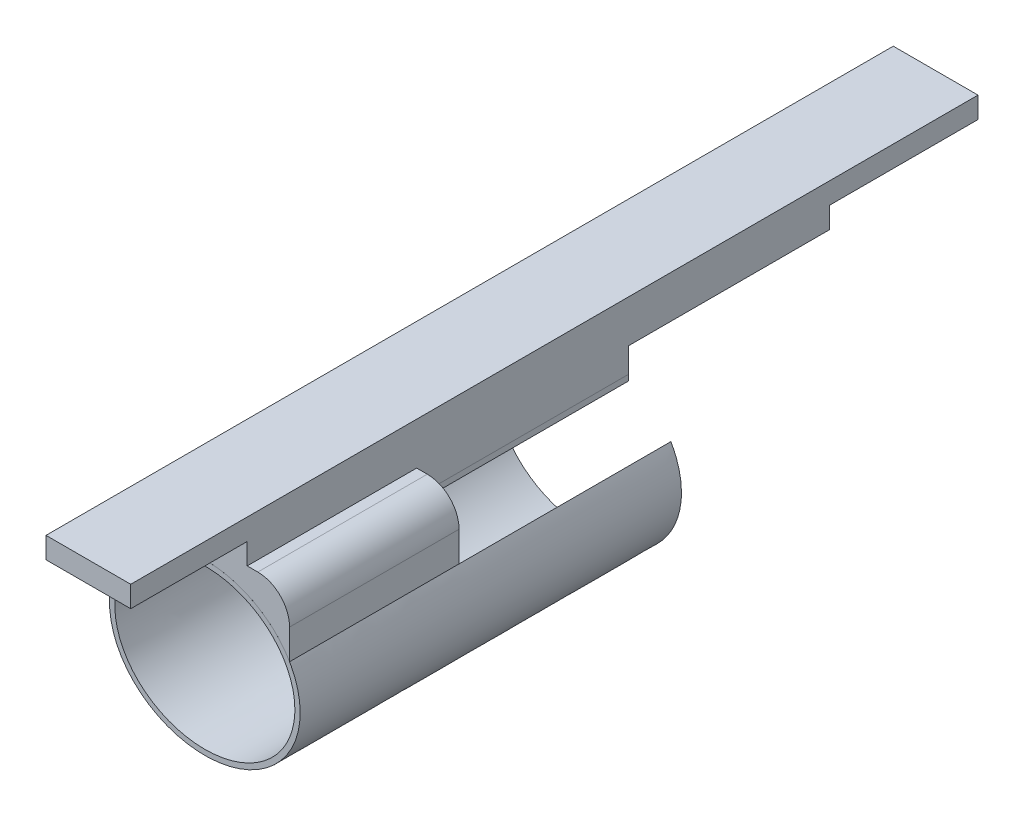
ISO-10303-21;
HEADER;
FILE_DESCRIPTION(('STEP AP214'),'2;1');
FILE_NAME('part.step','',(''),(''),'','','');
FILE_SCHEMA(('AUTOMOTIVE_DESIGN { 1 0 10303 214 1 1 1 1 }'));
ENDSEC;
DATA;
#1=APPLICATION_CONTEXT('core data for automotive mechanical design processes');
#2=APPLICATION_PROTOCOL_DEFINITION('international standard','automotive_design',2000,#1);
#3=PRODUCT_CONTEXT('',#1,'mechanical');
#4=PRODUCT('Part','Part','',(#3));
#5=PRODUCT_RELATED_PRODUCT_CATEGORY('part','',(#4));
#6=PRODUCT_DEFINITION_FORMATION('','',#4);
#7=PRODUCT_DEFINITION_CONTEXT('part definition',#1,'design');
#8=PRODUCT_DEFINITION('design','',#6,#7);
#9=PRODUCT_DEFINITION_SHAPE('','',#8);
#10=(LENGTH_UNIT() NAMED_UNIT(*) SI_UNIT(.MILLI.,.METRE.));
#11=(NAMED_UNIT(*) PLANE_ANGLE_UNIT() SI_UNIT($,.RADIAN.));
#12=(NAMED_UNIT(*) SI_UNIT($,.STERADIAN.) SOLID_ANGLE_UNIT());
#13=UNCERTAINTY_MEASURE_WITH_UNIT(LENGTH_MEASURE(1.E-05),#10,'distance_accuracy_value','');
#14=(GEOMETRIC_REPRESENTATION_CONTEXT(3) GLOBAL_UNCERTAINTY_ASSIGNED_CONTEXT((#13)) GLOBAL_UNIT_ASSIGNED_CONTEXT((#10,
#11,#12)) REPRESENTATION_CONTEXT('',''));
#15=CARTESIAN_POINT('',(0.,0.,0.));
#16=DIRECTION('',(0.,0.,1.));
#17=DIRECTION('',(1.,0.,0.));
#18=AXIS2_PLACEMENT_3D('',#15,#16,#17);
#19=CARTESIAN_POINT('',(0.,0.949999999999998,0.));
#20=DIRECTION('',(0.,1.,0.));
#21=DIRECTION('',(0.,0.,1.));
#22=AXIS2_PLACEMENT_3D('',#19,#20,#21);
#23=PLANE('',#22);
#24=DIRECTION('',(1.,0.,0.));
#25=VECTOR('',#24,1.);
#26=CARTESIAN_POINT('',(-0.4,0.949999999999998,2.));
#27=LINE('',#26,#25);
#28=CARTESIAN_POINT('',(-0.5,0.949999999999998,2.));
#29=VERTEX_POINT('',#28);
#30=CARTESIAN_POINT('',(-0.4,0.949999999999998,2.));
#31=VERTEX_POINT('',#30);
#32=EDGE_CURVE('E180',#29,#31,#27,.T.);
#33=ORIENTED_EDGE('',*,*,#32,.F.);
#34=DIRECTION('',(0.,0.,-1.));
#35=VECTOR('',#34,1.);
#36=CARTESIAN_POINT('',(-0.5,0.949999999999998,3.6));
#37=LINE('',#36,#35);
#38=CARTESIAN_POINT('',(-0.499999999999999,0.95,3.6));
#39=VERTEX_POINT('',#38);
#40=EDGE_CURVE('E219',#29,#39,#37,.F.);
#41=ORIENTED_EDGE('',*,*,#40,.T.);
#42=DIRECTION('',(-1.,0.,0.));
#43=VECTOR('',#42,1.);
#44=CARTESIAN_POINT('',(0.8,0.95,3.6));
#45=LINE('',#44,#43);
#46=CARTESIAN_POINT('',(-0.4,0.95,3.6));
#47=VERTEX_POINT('',#46);
#48=EDGE_CURVE('E236',#47,#39,#45,.T.);
#49=ORIENTED_EDGE('',*,*,#48,.F.);
#50=DIRECTION('',(0.,0.,1.));
#51=VECTOR('',#50,1.);
#52=CARTESIAN_POINT('',(-0.4,0.949999999999998,3.6));
#53=LINE('',#52,#51);
#54=EDGE_CURVE('E208',#31,#47,#53,.T.);
#55=ORIENTED_EDGE('',*,*,#54,.F.);
#56=EDGE_LOOP('',(#33,#41,#49,#55));
#57=FACE_BOUND('',#56,.T.);
#58=ADVANCED_FACE('F45',(#57),#23,.T.);
#59=DIRECTION('',(1.,0.,0.));
#60=VECTOR('',#59,1.);
#61=CARTESIAN_POINT('',(0.4,0.949999999999998,2.));
#62=LINE('',#61,#60);
#63=CARTESIAN_POINT('',(0.4,0.949999999999998,2.));
#64=VERTEX_POINT('',#63);
#65=CARTESIAN_POINT('',(0.5,0.949999999999998,2.));
#66=VERTEX_POINT('',#65);
#67=EDGE_CURVE('E60',#64,#66,#62,.T.);
#68=ORIENTED_EDGE('',*,*,#67,.F.);
#69=DIRECTION('',(0.,0.,-1.));
#70=VECTOR('',#69,1.);
#71=CARTESIAN_POINT('',(0.4,0.949999999999998,3.6));
#72=LINE('',#71,#70);
#73=CARTESIAN_POINT('',(0.4,0.95,3.6));
#74=VERTEX_POINT('',#73);
#75=EDGE_CURVE('E196',#74,#64,#72,.T.);
#76=ORIENTED_EDGE('',*,*,#75,.F.);
#77=CARTESIAN_POINT('',(0.5,0.95,3.6));
#78=VERTEX_POINT('',#77);
#79=EDGE_CURVE('E233',#78,#74,#45,.T.);
#80=ORIENTED_EDGE('',*,*,#79,.F.);
#81=DIRECTION('',(0.,0.,1.));
#82=VECTOR('',#81,1.);
#83=CARTESIAN_POINT('',(0.5,0.949999999999998,0.));
#84=LINE('',#83,#82);
#85=EDGE_CURVE('E226',#78,#66,#84,.F.);
#86=ORIENTED_EDGE('',*,*,#85,.T.);
#87=EDGE_LOOP('',(#68,#76,#80,#86));
#88=FACE_BOUND('',#87,.T.);
#89=ADVANCED_FACE('F383',(#88),#23,.T.);
#90=CARTESIAN_POINT('',(0.8,0.8,0.));
#91=DIRECTION('',(0.,0.,1.));
#92=DIRECTION('',(1.,0.,0.));
#93=AXIS2_PLACEMENT_3D('',#90,#91,#92);
#94=PLANE('',#93);
#95=CARTESIAN_POINT('',(0.,0.,0.));
#96=DIRECTION('',(0.,0.,1.));
#97=DIRECTION('',(1.,0.,0.));
#98=AXIS2_PLACEMENT_3D('',#95,#96,#97);
#99=ELLIPSE('',#98,0.9,0.8);
#100=CARTESIAN_POINT('',(0.4,0.716645133182093,0.));
#101=VERTEX_POINT('',#100);
#102=CARTESIAN_POINT('',(-0.4,0.716645133182093,0.));
#103=VERTEX_POINT('',#102);
#104=EDGE_CURVE('E176',#101,#103,#99,.T.);
#105=ORIENTED_EDGE('',*,*,#104,.T.);
#106=DIRECTION('',(0.,1.,0.));
#107=VECTOR('',#106,1.);
#108=CARTESIAN_POINT('',(-0.4,-0.801,0.));
#109=LINE('',#108,#107);
#110=CARTESIAN_POINT('',(-0.4,0.949999999999998,0.));
#111=VERTEX_POINT('',#110);
#112=EDGE_CURVE('E169',#103,#111,#109,.T.);
#113=ORIENTED_EDGE('',*,*,#112,.T.);
#114=DIRECTION('',(1.,0.,0.));
#115=VECTOR('',#114,1.);
#116=CARTESIAN_POINT('',(0.8,0.95,0.));
#117=LINE('',#116,#115);
#118=CARTESIAN_POINT('',(0.4,0.949999999999998,0.));
#119=VERTEX_POINT('',#118);
#120=EDGE_CURVE('E173',#111,#119,#117,.T.);
#121=ORIENTED_EDGE('',*,*,#120,.T.);
#122=DIRECTION('',(0.,1.,0.));
#123=VECTOR('',#122,1.);
#124=CARTESIAN_POINT('',(0.4,-0.801,0.));
#125=LINE('',#124,#123);
#126=EDGE_CURVE('E320',#101,#119,#125,.T.);
#127=ORIENTED_EDGE('',*,*,#126,.F.);
#128=EDGE_LOOP('',(#105,#113,#121,#127));
#129=FACE_BOUND('',#128,.T.);
#130=ADVANCED_FACE('F171',(#129),#94,.F.);
#131=CARTESIAN_POINT('',(-0.8,0.8,0.));
#132=DIRECTION('',(1.,0.,0.));
#133=DIRECTION('',(0.,0.,-1.));
#134=AXIS2_PLACEMENT_3D('',#131,#132,#133);
#135=PLANE('',#134);
#136=DIRECTION('',(0.,0.,-1.));
#137=VECTOR('',#136,1.);
#138=CARTESIAN_POINT('',(-0.8,0.649999999999998,0.));
#139=LINE('',#138,#137);
#140=CARTESIAN_POINT('',(-0.8,0.649999999999998,3.6));
#141=VERTEX_POINT('',#140);
#142=CARTESIAN_POINT('',(-0.8,0.649999999999998,2.));
#143=VERTEX_POINT('',#142);
#144=EDGE_CURVE('E221',#141,#143,#139,.T.);
#145=ORIENTED_EDGE('',*,*,#144,.T.);
#146=DIRECTION('',(0.,1.,0.));
#147=VECTOR('',#146,1.);
#148=CARTESIAN_POINT('',(-0.8,-0.801,2.));
#149=LINE('',#148,#147);
#150=CARTESIAN_POINT('',(-0.8,0.366498277832681,2.));
#151=VERTEX_POINT('',#150);
#152=EDGE_CURVE('E68',#151,#143,#149,.T.);
#153=ORIENTED_EDGE('',*,*,#152,.F.);
#154=DIRECTION('',(0.,0.,-1.));
#155=VECTOR('',#154,1.);
#156=CARTESIAN_POINT('',(-0.8,0.366498277832681,3.6));
#157=LINE('',#156,#155);
#158=CARTESIAN_POINT('',(-0.8,0.36649827783268,3.6));
#159=VERTEX_POINT('',#158);
#160=EDGE_CURVE('E260',#151,#159,#157,.F.);
#161=ORIENTED_EDGE('',*,*,#160,.T.);
#162=DIRECTION('',(0.,1.,0.));
#163=VECTOR('',#162,1.);
#164=CARTESIAN_POINT('',(-0.8,0.8,3.6));
#165=LINE('',#164,#163);
#166=EDGE_CURVE('E188',#159,#141,#165,.T.);
#167=ORIENTED_EDGE('',*,*,#166,.T.);
#168=EDGE_LOOP('',(#145,#153,#161,#167));
#169=FACE_BOUND('',#168,.T.);
#170=ADVANCED_FACE('F387',(#169),#135,.F.);
#171=CARTESIAN_POINT('',(0.8,0.8,3.6));
#172=DIRECTION('',(0.,0.,-1.));
#173=DIRECTION('',(-1.,0.,0.));
#174=AXIS2_PLACEMENT_3D('',#171,#172,#173);
#175=PLANE('',#174);
#176=DIRECTION('',(0.,1.,0.));
#177=VECTOR('',#176,1.);
#178=CARTESIAN_POINT('',(0.8,0.8,3.6));
#179=LINE('',#178,#177);
#180=CARTESIAN_POINT('',(0.8,0.36649827783268,3.6));
#181=VERTEX_POINT('',#180);
#182=CARTESIAN_POINT('',(0.8,0.649999999999998,3.6));
#183=VERTEX_POINT('',#182);
#184=EDGE_CURVE('E211',#181,#183,#179,.T.);
#185=ORIENTED_EDGE('',*,*,#184,.T.);
#186=CARTESIAN_POINT('',(0.5,0.649999999999998,3.6));
#187=DIRECTION('',(0.,0.,-1.));
#188=DIRECTION('',(-1.,0.,0.));
#189=AXIS2_PLACEMENT_3D('',#186,#187,#188);
#190=CIRCLE('',#189,0.3);
#191=EDGE_CURVE('E229',#183,#78,#190,.F.);
#192=ORIENTED_EDGE('',*,*,#191,.T.);
#193=ORIENTED_EDGE('',*,*,#79,.T.);
#194=DIRECTION('',(0.,-1.,0.));
#195=VECTOR('',#194,1.);
#196=CARTESIAN_POINT('',(0.4,1.15,3.6));
#197=LINE('',#196,#195);
#198=CARTESIAN_POINT('',(0.4,1.15,3.6));
#199=VERTEX_POINT('',#198);
#200=EDGE_CURVE('E251',#199,#74,#197,.T.);
#201=ORIENTED_EDGE('',*,*,#200,.F.);
#202=DIRECTION('',(1.,0.,0.));
#203=VECTOR('',#202,1.);
#204=CARTESIAN_POINT('',(-0.4,1.15,3.6));
#205=LINE('',#204,#203);
#206=CARTESIAN_POINT('',(-0.4,1.15,3.6));
#207=VERTEX_POINT('',#206);
#208=EDGE_CURVE('E269',#207,#199,#205,.T.);
#209=ORIENTED_EDGE('',*,*,#208,.F.);
#210=DIRECTION('',(0.,-1.,0.));
#211=VECTOR('',#210,1.);
#212=CARTESIAN_POINT('',(-0.4,1.15,3.6));
#213=LINE('',#212,#211);
#214=EDGE_CURVE('E254',#207,#47,#213,.T.);
#215=ORIENTED_EDGE('',*,*,#214,.T.);
#216=ORIENTED_EDGE('',*,*,#48,.T.);
#217=CARTESIAN_POINT('',(-0.5,0.649999999999998,3.6));
#218=DIRECTION('',(0.,0.,-1.));
#219=DIRECTION('',(-1.,0.,0.));
#220=AXIS2_PLACEMENT_3D('',#217,#218,#219);
#221=CIRCLE('',#220,0.3);
#222=EDGE_CURVE('E231',#39,#141,#221,.F.);
#223=ORIENTED_EDGE('',*,*,#222,.T.);
#224=ORIENTED_EDGE('',*,*,#166,.F.);
#225=CARTESIAN_POINT('',(0.,0.,3.6));
#226=DIRECTION('',(0.,0.,1.));
#227=DIRECTION('',(1.,0.,0.));
#228=AXIS2_PLACEMENT_3D('',#225,#226,#227);
#229=ELLIPSE('',#228,0.9,0.8);
#230=EDGE_CURVE('E370',#159,#181,#229,.F.);
#231=ORIENTED_EDGE('',*,*,#230,.T.);
#232=EDGE_LOOP('',(#185,#192,#193,#201,#209,#215,#216,#223,#224,#231));
#233=FACE_BOUND('',#232,.T.);
#234=ADVANCED_FACE('F338',(#233),#175,.F.);
#235=CARTESIAN_POINT('',(0.8,0.8,0.));
#236=DIRECTION('',(-1.,0.,0.));
#237=DIRECTION('',(0.,0.,1.));
#238=AXIS2_PLACEMENT_3D('',#235,#236,#237);
#239=PLANE('',#238);
#240=DIRECTION('',(0.,0.,-1.));
#241=VECTOR('',#240,1.);
#242=CARTESIAN_POINT('',(0.8,0.36649827783268,3.6));
#243=LINE('',#242,#241);
#244=CARTESIAN_POINT('',(0.8,0.36649827783268,2.));
#245=VERTEX_POINT('',#244);
#246=EDGE_CURVE('E367',#181,#245,#243,.T.);
#247=ORIENTED_EDGE('',*,*,#246,.T.);
#248=DIRECTION('',(0.,1.,0.));
#249=VECTOR('',#248,1.);
#250=CARTESIAN_POINT('',(0.8,-0.801,2.));
#251=LINE('',#250,#249);
#252=CARTESIAN_POINT('',(0.8,0.649999999999998,2.));
#253=VERTEX_POINT('',#252);
#254=EDGE_CURVE('E317',#245,#253,#251,.T.);
#255=ORIENTED_EDGE('',*,*,#254,.T.);
#256=DIRECTION('',(0.,0.,1.));
#257=VECTOR('',#256,1.);
#258=CARTESIAN_POINT('',(0.8,0.649999999999998,3.6));
#259=LINE('',#258,#257);
#260=EDGE_CURVE('E210',#253,#183,#259,.T.);
#261=ORIENTED_EDGE('',*,*,#260,.T.);
#262=ORIENTED_EDGE('',*,*,#184,.F.);
#263=EDGE_LOOP('',(#247,#255,#261,#262));
#264=FACE_BOUND('',#263,.T.);
#265=ADVANCED_FACE('F381',(#264),#239,.F.);
#266=CARTESIAN_POINT('',(0.,0.,3.6));
#267=DIRECTION('',(0.,0.,1.));
#268=DIRECTION('',(1.,0.,0.));
#269=AXIS2_PLACEMENT_3D('',#266,#267,#268);
#270=ELLIPSE('',#269,0.9,0.8);
#271=DIRECTION('',(0.,0.,-1.));
#272=VECTOR('',#271,1.);
#273=SURFACE_OF_LINEAR_EXTRUSION('',#270,#272);
#274=CARTESIAN_POINT('',(0.,0.,2.));
#275=DIRECTION('',(0.,0.,1.));
#276=DIRECTION('',(1.,0.,0.));
#277=AXIS2_PLACEMENT_3D('',#274,#275,#276);
#278=ELLIPSE('',#277,0.9,0.8);
#279=CARTESIAN_POINT('',(-0.4,0.716645133182093,2.));
#280=VERTEX_POINT('',#279);
#281=EDGE_CURVE('E314',#280,#151,#278,.T.);
#282=ORIENTED_EDGE('',*,*,#281,.F.);
#283=DIRECTION('',(0.,0.,-1.));
#284=VECTOR('',#283,1.);
#285=CARTESIAN_POINT('',(-0.4,0.716645133182093,3.6));
#286=LINE('',#285,#284);
#287=EDGE_CURVE('E13',#103,#280,#286,.F.);
#288=ORIENTED_EDGE('',*,*,#287,.F.);
#289=ORIENTED_EDGE('',*,*,#104,.F.);
#290=DIRECTION('',(0.,0.,-1.));
#291=VECTOR('',#290,1.);
#292=CARTESIAN_POINT('',(0.4,0.716645133182093,3.6));
#293=LINE('',#292,#291);
#294=CARTESIAN_POINT('',(0.4,0.716645133182093,2.));
#295=VERTEX_POINT('',#294);
#296=EDGE_CURVE('E53',#295,#101,#293,.T.);
#297=ORIENTED_EDGE('',*,*,#296,.F.);
#298=CARTESIAN_POINT('',(0.,0.,2.));
#299=DIRECTION('',(0.,0.,1.));
#300=DIRECTION('',(1.,0.,0.));
#301=AXIS2_PLACEMENT_3D('',#298,#299,#300);
#302=ELLIPSE('',#301,0.9,0.8);
#303=EDGE_CURVE('E312',#245,#295,#302,.T.);
#304=ORIENTED_EDGE('',*,*,#303,.F.);
#305=ORIENTED_EDGE('',*,*,#246,.F.);
#306=ORIENTED_EDGE('',*,*,#230,.F.);
#307=ORIENTED_EDGE('',*,*,#160,.F.);
#308=EDGE_LOOP('',(#282,#288,#289,#297,#304,#305,#306,#307));
#309=FACE_BOUND('',#308,.T.);
#310=ADVANCED_FACE('F377',(#309),#273,.T.);
#311=CARTESIAN_POINT('',(0.,0.949999999999998,0.));
#312=DIRECTION('',(0.,-1.,0.));
#313=DIRECTION('',(0.,0.,-1.));
#314=AXIS2_PLACEMENT_3D('',#311,#312,#313);
#315=PLANE('',#314);
#316=ORIENTED_EDGE('',*,*,#120,.F.);
#317=CARTESIAN_POINT('',(-0.4,0.949999999999998,-1.9));
#318=VERTEX_POINT('',#317);
#319=EDGE_CURVE('E186',#318,#111,#53,.T.);
#320=ORIENTED_EDGE('',*,*,#319,.F.);
#321=DIRECTION('',(-1.,0.,0.));
#322=VECTOR('',#321,1.);
#323=CARTESIAN_POINT('',(-0.4,0.949999999999998,-1.9));
#324=LINE('',#323,#322);
#325=CARTESIAN_POINT('',(0.4,0.949999999999998,-1.9));
#326=VERTEX_POINT('',#325);
#327=EDGE_CURVE('E250',#326,#318,#324,.T.);
#328=ORIENTED_EDGE('',*,*,#327,.F.);
#329=EDGE_CURVE('E187',#119,#326,#72,.T.);
#330=ORIENTED_EDGE('',*,*,#329,.F.);
#331=EDGE_LOOP('',(#316,#320,#328,#330));
#332=FACE_BOUND('',#331,.T.);
#333=ADVANCED_FACE('F184',(#332),#315,.T.);
#334=CARTESIAN_POINT('',(-0.4,1.15,3.6));
#335=DIRECTION('',(1.,0.,0.));
#336=DIRECTION('',(0.,0.,-1.));
#337=AXIS2_PLACEMENT_3D('',#334,#335,#336);
#338=PLANE('',#337);
#339=ORIENTED_EDGE('',*,*,#319,.T.);
#340=ORIENTED_EDGE('',*,*,#112,.F.);
#341=ORIENTED_EDGE('',*,*,#287,.T.);
#342=DIRECTION('',(0.,1.,0.));
#343=VECTOR('',#342,1.);
#344=CARTESIAN_POINT('',(-0.4,-0.801,2.));
#345=LINE('',#344,#343);
#346=EDGE_CURVE('E316',#280,#31,#345,.T.);
#347=ORIENTED_EDGE('',*,*,#346,.T.);
#348=ORIENTED_EDGE('',*,*,#54,.T.);
#349=ORIENTED_EDGE('',*,*,#214,.F.);
#350=DIRECTION('',(0.,0.,1.));
#351=VECTOR('',#350,1.);
#352=CARTESIAN_POINT('',(-0.4,1.15,-3.3));
#353=LINE('',#352,#351);
#354=CARTESIAN_POINT('',(-0.4,1.15,4.7));
#355=VERTEX_POINT('',#354);
#356=EDGE_CURVE('E276',#207,#355,#353,.T.);
#357=ORIENTED_EDGE('',*,*,#356,.T.);
#358=DIRECTION('',(0.,-1.,0.));
#359=VECTOR('',#358,1.);
#360=CARTESIAN_POINT('',(-0.4,1.35,4.7));
#361=LINE('',#360,#359);
#362=CARTESIAN_POINT('',(-0.4,1.35,4.7));
#363=VERTEX_POINT('',#362);
#364=EDGE_CURVE('E293',#363,#355,#361,.T.);
#365=ORIENTED_EDGE('',*,*,#364,.F.);
#366=DIRECTION('',(0.,0.,1.));
#367=VECTOR('',#366,1.);
#368=CARTESIAN_POINT('',(-0.4,1.35,-3.3));
#369=LINE('',#368,#367);
#370=CARTESIAN_POINT('',(-0.4,1.35,-3.3));
#371=VERTEX_POINT('',#370);
#372=EDGE_CURVE('E306',#371,#363,#369,.T.);
#373=ORIENTED_EDGE('',*,*,#372,.F.);
#374=DIRECTION('',(0.,-1.,0.));
#375=VECTOR('',#374,1.);
#376=CARTESIAN_POINT('',(-0.4,1.35,-3.3));
#377=LINE('',#376,#375);
#378=CARTESIAN_POINT('',(-0.4,1.15,-3.3));
#379=VERTEX_POINT('',#378);
#380=EDGE_CURVE('E199',#371,#379,#377,.T.);
#381=ORIENTED_EDGE('',*,*,#380,.T.);
#382=CARTESIAN_POINT('',(-0.4,1.15,-1.9));
#383=VERTEX_POINT('',#382);
#384=EDGE_CURVE('E279',#379,#383,#353,.T.);
#385=ORIENTED_EDGE('',*,*,#384,.T.);
#386=DIRECTION('',(0.,-1.,0.));
#387=VECTOR('',#386,1.);
#388=CARTESIAN_POINT('',(-0.4,1.15,-1.9));
#389=LINE('',#388,#387);
#390=EDGE_CURVE('E193',#383,#318,#389,.T.);
#391=ORIENTED_EDGE('',*,*,#390,.T.);
#392=EDGE_LOOP('',(#339,#340,#341,#347,#348,#349,#357,#365,#373,#381,#385,#391));
#393=FACE_BOUND('',#392,.T.);
#394=ADVANCED_FACE('F191',(#393),#338,.F.);
#395=CARTESIAN_POINT('',(0.4,1.15,3.6));
#396=DIRECTION('',(-1.,0.,0.));
#397=DIRECTION('',(0.,0.,1.));
#398=AXIS2_PLACEMENT_3D('',#395,#396,#397);
#399=PLANE('',#398);
#400=ORIENTED_EDGE('',*,*,#75,.T.);
#401=DIRECTION('',(0.,1.,0.));
#402=VECTOR('',#401,1.);
#403=CARTESIAN_POINT('',(0.4,-0.801,2.));
#404=LINE('',#403,#402);
#405=EDGE_CURVE('E319',#295,#64,#404,.T.);
#406=ORIENTED_EDGE('',*,*,#405,.F.);
#407=ORIENTED_EDGE('',*,*,#296,.T.);
#408=ORIENTED_EDGE('',*,*,#126,.T.);
#409=ORIENTED_EDGE('',*,*,#329,.T.);
#410=DIRECTION('',(0.,-1.,0.));
#411=VECTOR('',#410,1.);
#412=CARTESIAN_POINT('',(0.4,1.15,-1.9));
#413=LINE('',#412,#411);
#414=CARTESIAN_POINT('',(0.4,1.15,-1.9));
#415=VERTEX_POINT('',#414);
#416=EDGE_CURVE('E255',#415,#326,#413,.T.);
#417=ORIENTED_EDGE('',*,*,#416,.F.);
#418=DIRECTION('',(0.,0.,-1.));
#419=VECTOR('',#418,1.);
#420=CARTESIAN_POINT('',(0.4,1.15,-3.3));
#421=LINE('',#420,#419);
#422=CARTESIAN_POINT('',(0.4,1.15,-3.3));
#423=VERTEX_POINT('',#422);
#424=EDGE_CURVE('E301',#415,#423,#421,.T.);
#425=ORIENTED_EDGE('',*,*,#424,.T.);
#426=DIRECTION('',(0.,-1.,0.));
#427=VECTOR('',#426,1.);
#428=CARTESIAN_POINT('',(0.4,1.35,-3.3));
#429=LINE('',#428,#427);
#430=CARTESIAN_POINT('',(0.4,1.35,-3.3));
#431=VERTEX_POINT('',#430);
#432=EDGE_CURVE('E194',#431,#423,#429,.T.);
#433=ORIENTED_EDGE('',*,*,#432,.F.);
#434=DIRECTION('',(0.,0.,-1.));
#435=VECTOR('',#434,1.);
#436=CARTESIAN_POINT('',(0.4,1.35,-3.3));
#437=LINE('',#436,#435);
#438=CARTESIAN_POINT('',(0.400000000000001,1.35,4.7));
#439=VERTEX_POINT('',#438);
#440=EDGE_CURVE('E289',#439,#431,#437,.T.);
#441=ORIENTED_EDGE('',*,*,#440,.F.);
#442=DIRECTION('',(0.,-1.,0.));
#443=VECTOR('',#442,1.);
#444=CARTESIAN_POINT('',(0.400000000000001,1.35,4.7));
#445=LINE('',#444,#443);
#446=CARTESIAN_POINT('',(0.400000000000001,1.15,4.7));
#447=VERTEX_POINT('',#446);
#448=EDGE_CURVE('E290',#439,#447,#445,.T.);
#449=ORIENTED_EDGE('',*,*,#448,.T.);
#450=EDGE_CURVE('E299',#447,#199,#421,.T.);
#451=ORIENTED_EDGE('',*,*,#450,.T.);
#452=ORIENTED_EDGE('',*,*,#200,.T.);
#453=EDGE_LOOP('',(#400,#406,#407,#408,#409,#417,#425,#433,#441,#449,#451,#452));
#454=FACE_BOUND('',#453,.T.);
#455=ADVANCED_FACE('F350',(#454),#399,.F.);
#456=CARTESIAN_POINT('',(-0.4,1.15,-1.9));
#457=DIRECTION('',(0.,0.,1.));
#458=DIRECTION('',(1.,0.,0.));
#459=AXIS2_PLACEMENT_3D('',#456,#457,#458);
#460=PLANE('',#459);
#461=ORIENTED_EDGE('',*,*,#327,.T.);
#462=ORIENTED_EDGE('',*,*,#390,.F.);
#463=DIRECTION('',(-1.,0.,0.));
#464=VECTOR('',#463,1.);
#465=CARTESIAN_POINT('',(-0.4,1.15,-1.9));
#466=LINE('',#465,#464);
#467=EDGE_CURVE('E264',#415,#383,#466,.T.);
#468=ORIENTED_EDGE('',*,*,#467,.F.);
#469=ORIENTED_EDGE('',*,*,#416,.T.);
#470=EDGE_LOOP('',(#461,#462,#468,#469));
#471=FACE_BOUND('',#470,.T.);
#472=ADVANCED_FACE('F364',(#471),#460,.F.);
#473=CARTESIAN_POINT('',(0.,1.15,0.));
#474=DIRECTION('',(0.,-1.,0.));
#475=DIRECTION('',(0.,0.,-1.));
#476=AXIS2_PLACEMENT_3D('',#473,#474,#475);
#477=PLANE('',#476);
#478=ORIENTED_EDGE('',*,*,#356,.F.);
#479=ORIENTED_EDGE('',*,*,#208,.T.);
#480=ORIENTED_EDGE('',*,*,#450,.F.);
#481=DIRECTION('',(1.,0.,0.));
#482=VECTOR('',#481,1.);
#483=CARTESIAN_POINT('',(0.400000000000001,1.15,4.7));
#484=LINE('',#483,#482);
#485=EDGE_CURVE('E286',#355,#447,#484,.T.);
#486=ORIENTED_EDGE('',*,*,#485,.F.);
#487=EDGE_LOOP('',(#478,#479,#480,#486));
#488=FACE_BOUND('',#487,.T.);
#489=ADVANCED_FACE('F343',(#488),#477,.T.);
#490=CARTESIAN_POINT('',(0.4,1.35,-3.3));
#491=DIRECTION('',(0.,0.,1.));
#492=DIRECTION('',(1.,0.,0.));
#493=AXIS2_PLACEMENT_3D('',#490,#491,#492);
#494=PLANE('',#493);
#495=DIRECTION('',(-1.,0.,0.));
#496=VECTOR('',#495,1.);
#497=CARTESIAN_POINT('',(0.4,1.15,-3.3));
#498=LINE('',#497,#496);
#499=EDGE_CURVE('E280',#423,#379,#498,.T.);
#500=ORIENTED_EDGE('',*,*,#499,.T.);
#501=ORIENTED_EDGE('',*,*,#380,.F.);
#502=DIRECTION('',(-1.,0.,0.));
#503=VECTOR('',#502,1.);
#504=CARTESIAN_POINT('',(0.4,1.35,-3.3));
#505=LINE('',#504,#503);
#506=EDGE_CURVE('E308',#431,#371,#505,.T.);
#507=ORIENTED_EDGE('',*,*,#506,.F.);
#508=ORIENTED_EDGE('',*,*,#432,.T.);
#509=EDGE_LOOP('',(#500,#501,#507,#508));
#510=FACE_BOUND('',#509,.T.);
#511=ADVANCED_FACE('F463',(#510),#494,.F.);
#512=CARTESIAN_POINT('',(0.400000000000001,1.35,4.7));
#513=DIRECTION('',(0.,0.,-1.));
#514=DIRECTION('',(-1.,0.,0.));
#515=AXIS2_PLACEMENT_3D('',#512,#513,#514);
#516=PLANE('',#515);
#517=ORIENTED_EDGE('',*,*,#485,.T.);
#518=ORIENTED_EDGE('',*,*,#448,.F.);
#519=DIRECTION('',(1.,0.,0.));
#520=VECTOR('',#519,1.);
#521=CARTESIAN_POINT('',(0.400000000000001,1.35,4.7));
#522=LINE('',#521,#520);
#523=EDGE_CURVE('E294',#363,#439,#522,.T.);
#524=ORIENTED_EDGE('',*,*,#523,.F.);
#525=ORIENTED_EDGE('',*,*,#364,.T.);
#526=EDGE_LOOP('',(#517,#518,#524,#525));
#527=FACE_BOUND('',#526,.T.);
#528=ADVANCED_FACE('F347',(#527),#516,.F.);
#529=CARTESIAN_POINT('',(0.,1.35,0.));
#530=DIRECTION('',(0.,-1.,0.));
#531=DIRECTION('',(0.,0.,-1.));
#532=AXIS2_PLACEMENT_3D('',#529,#530,#531);
#533=PLANE('',#532);
#534=ORIENTED_EDGE('',*,*,#440,.T.);
#535=ORIENTED_EDGE('',*,*,#506,.T.);
#536=ORIENTED_EDGE('',*,*,#372,.T.);
#537=ORIENTED_EDGE('',*,*,#523,.T.);
#538=EDGE_LOOP('',(#534,#535,#536,#537));
#539=FACE_BOUND('',#538,.T.);
#540=ADVANCED_FACE('F353',(#539),#533,.F.);
#541=ORIENTED_EDGE('',*,*,#424,.F.);
#542=ORIENTED_EDGE('',*,*,#467,.T.);
#543=ORIENTED_EDGE('',*,*,#384,.F.);
#544=ORIENTED_EDGE('',*,*,#499,.F.);
#545=EDGE_LOOP('',(#541,#542,#543,#544));
#546=FACE_BOUND('',#545,.T.);
#547=ADVANCED_FACE('F361',(#546),#477,.T.);
#548=CARTESIAN_POINT('',(0.5,0.649999999999998,0.));
#549=DIRECTION('',(0.,0.,-1.));
#550=DIRECTION('',(-1.,0.,0.));
#551=AXIS2_PLACEMENT_3D('',#548,#549,#550);
#552=CYLINDRICAL_SURFACE('',#551,0.3);
#553=CARTESIAN_POINT('',(0.5,0.649999999999998,2.));
#554=DIRECTION('',(0.,0.,1.));
#555=DIRECTION('',(1.,0.,0.));
#556=AXIS2_PLACEMENT_3D('',#553,#554,#555);
#557=CIRCLE('',#556,0.3);
#558=EDGE_CURVE('E212',#66,#253,#557,.F.);
#559=ORIENTED_EDGE('',*,*,#558,.F.);
#560=ORIENTED_EDGE('',*,*,#85,.F.);
#561=ORIENTED_EDGE('',*,*,#191,.F.);
#562=ORIENTED_EDGE('',*,*,#260,.F.);
#563=EDGE_LOOP('',(#559,#560,#561,#562));
#564=FACE_BOUND('',#563,.T.);
#565=ADVANCED_FACE('F398',(#564),#552,.T.);
#566=CARTESIAN_POINT('',(-0.5,0.649999999999998,0.));
#567=DIRECTION('',(0.,0.,1.));
#568=DIRECTION('',(1.,0.,0.));
#569=AXIS2_PLACEMENT_3D('',#566,#567,#568);
#570=CYLINDRICAL_SURFACE('',#569,0.3);
#571=CARTESIAN_POINT('',(-0.5,0.649999999999998,2.));
#572=DIRECTION('',(0.,0.,1.));
#573=DIRECTION('',(1.,0.,0.));
#574=AXIS2_PLACEMENT_3D('',#571,#572,#573);
#575=CIRCLE('',#574,0.3);
#576=EDGE_CURVE('E217',#143,#29,#575,.F.);
#577=ORIENTED_EDGE('',*,*,#576,.F.);
#578=ORIENTED_EDGE('',*,*,#144,.F.);
#579=ORIENTED_EDGE('',*,*,#222,.F.);
#580=ORIENTED_EDGE('',*,*,#40,.F.);
#581=EDGE_LOOP('',(#577,#578,#579,#580));
#582=FACE_BOUND('',#581,.T.);
#583=ADVANCED_FACE('F47',(#582),#570,.T.);
#584=CARTESIAN_POINT('',(-0.4,-0.801,2.));
#585=DIRECTION('',(0.,0.,1.));
#586=DIRECTION('',(1.,0.,0.));
#587=AXIS2_PLACEMENT_3D('',#584,#585,#586);
#588=PLANE('',#587);
#589=ORIENTED_EDGE('',*,*,#281,.T.);
#590=ORIENTED_EDGE('',*,*,#152,.T.);
#591=ORIENTED_EDGE('',*,*,#576,.T.);
#592=ORIENTED_EDGE('',*,*,#32,.T.);
#593=ORIENTED_EDGE('',*,*,#346,.F.);
#594=EDGE_LOOP('',(#589,#590,#591,#592,#593));
#595=FACE_BOUND('',#594,.T.);
#596=ADVANCED_FACE('F328',(#595),#588,.F.);
#597=CARTESIAN_POINT('',(0.4,-0.801,2.));
#598=DIRECTION('',(0.,0.,1.));
#599=DIRECTION('',(1.,0.,0.));
#600=AXIS2_PLACEMENT_3D('',#597,#598,#599);
#601=PLANE('',#600);
#602=ORIENTED_EDGE('',*,*,#303,.T.);
#603=ORIENTED_EDGE('',*,*,#405,.T.);
#604=ORIENTED_EDGE('',*,*,#67,.T.);
#605=ORIENTED_EDGE('',*,*,#558,.T.);
#606=ORIENTED_EDGE('',*,*,#254,.F.);
#607=EDGE_LOOP('',(#602,#603,#604,#605,#606));
#608=FACE_BOUND('',#607,.T.);
#609=ADVANCED_FACE('F517',(#608),#601,.F.);
#610=CLOSED_SHELL('',(#58,#89,#130,#170,#234,#265,#310,#333,#394,#455,#472,#489,#511,#528,#540,
#547,#565,#583,#596,#609));
#611=MANIFOLD_SOLID_BREP('B2',#610);
#612=CARTESIAN_POINT('',(0.,0.,0.));
#613=DIRECTION('',(0.,0.,1.));
#614=DIRECTION('',(1.,0.,0.));
#615=AXIS2_PLACEMENT_3D('',#612,#613,#614);
#616=PLANE('',#615);
#617=CARTESIAN_POINT('',(0.,0.,0.));
#618=DIRECTION('',(0.,0.,1.));
#619=DIRECTION('',(1.,0.,0.));
#620=AXIS2_PLACEMENT_3D('',#617,#618,#619);
#621=ELLIPSE('',#620,0.9,0.8);
#622=CARTESIAN_POINT('',(-0.8,0.36649827783268,0.));
#623=VERTEX_POINT('',#622);
#624=CARTESIAN_POINT('',(0.8,0.36649827783268,0.));
#625=VERTEX_POINT('',#624);
#626=EDGE_CURVE('E584',#623,#625,#621,.T.);
#627=ORIENTED_EDGE('',*,*,#626,.F.);
#628=DIRECTION('',(0.,1.,0.));
#629=VECTOR('',#628,1.);
#630=CARTESIAN_POINT('',(-0.8,-0.801,0.));
#631=LINE('',#630,#629);
#632=CARTESIAN_POINT('',(-0.8,0.253436587347266,0.));
#633=VERTEX_POINT('',#632);
#634=EDGE_CURVE('E657',#633,#623,#631,.T.);
#635=ORIENTED_EDGE('',*,*,#634,.F.);
#636=CARTESIAN_POINT('',(0.,0.,0.));
#637=DIRECTION('',(0.,0.,1.));
#638=DIRECTION('',(1.,0.,0.));
#639=AXIS2_PLACEMENT_3D('',#636,#637,#638);
#640=ELLIPSE('',#639,0.85,0.75);
#641=CARTESIAN_POINT('',(0.8,0.253436587347266,0.));
#642=VERTEX_POINT('',#641);
#643=EDGE_CURVE('E670',#642,#633,#640,.F.);
#644=ORIENTED_EDGE('',*,*,#643,.F.);
#645=DIRECTION('',(0.,1.,0.));
#646=VECTOR('',#645,1.);
#647=CARTESIAN_POINT('',(0.8,-0.801,0.));
#648=LINE('',#647,#646);
#649=EDGE_CURVE('E688',#642,#625,#648,.T.);
#650=ORIENTED_EDGE('',*,*,#649,.T.);
#651=EDGE_LOOP('',(#627,#635,#644,#650));
#652=FACE_BOUND('',#651,.T.);
#653=ADVANCED_FACE('F579',(#652),#616,.F.);
#654=CARTESIAN_POINT('',(0.,0.,3.6));
#655=DIRECTION('',(0.,0.,1.));
#656=DIRECTION('',(1.,0.,0.));
#657=AXIS2_PLACEMENT_3D('',#654,#655,#656);
#658=ELLIPSE('',#657,0.9,0.8);
#659=DIRECTION('',(0.,0.,-1.));
#660=VECTOR('',#659,1.);
#661=SURFACE_OF_LINEAR_EXTRUSION('',#658,#660);
#662=CARTESIAN_POINT('',(0.9,0.,3.6));
#663=VERTEX_POINT('',#662);
#664=EDGE_CURVE('E43',#663,#663,#658,.T.);
#665=ORIENTED_EDGE('',*,*,#664,.F.);
#666=EDGE_LOOP('',(#665));
#667=FACE_BOUND('',#666,.T.);
#668=CARTESIAN_POINT('',(0.,0.,2.));
#669=DIRECTION('',(0.,0.,1.));
#670=DIRECTION('',(1.,0.,0.));
#671=AXIS2_PLACEMENT_3D('',#668,#669,#670);
#672=ELLIPSE('',#671,0.9,0.8);
#673=CARTESIAN_POINT('',(-0.4,0.716645133182093,2.));
#674=VERTEX_POINT('',#673);
#675=CARTESIAN_POINT('',(-0.8,0.366498277832681,2.));
#676=VERTEX_POINT('',#675);
#677=EDGE_CURVE('E705',#674,#676,#672,.T.);
#678=ORIENTED_EDGE('',*,*,#677,.T.);
#679=DIRECTION('',(0.,0.,-1.));
#680=VECTOR('',#679,1.);
#681=CARTESIAN_POINT('',(-0.799999999999999,0.366498277832681,3.6));
#682=LINE('',#681,#680);
#683=EDGE_CURVE('E653',#676,#623,#682,.T.);
#684=ORIENTED_EDGE('',*,*,#683,.T.);
#685=ORIENTED_EDGE('',*,*,#626,.T.);
#686=DIRECTION('',(0.,0.,-1.));
#687=VECTOR('',#686,1.);
#688=CARTESIAN_POINT('',(0.8,0.36649827783268,3.6));
#689=LINE('',#688,#687);
#690=CARTESIAN_POINT('',(0.8,0.36649827783268,2.));
#691=VERTEX_POINT('',#690);
#692=EDGE_CURVE('E699',#625,#691,#689,.F.);
#693=ORIENTED_EDGE('',*,*,#692,.T.);
#694=CARTESIAN_POINT('',(0.,0.,2.));
#695=DIRECTION('',(0.,0.,1.));
#696=DIRECTION('',(1.,0.,0.));
#697=AXIS2_PLACEMENT_3D('',#694,#695,#696);
#698=ELLIPSE('',#697,0.9,0.8);
#699=CARTESIAN_POINT('',(0.4,0.716645133182093,2.));
#700=VERTEX_POINT('',#699);
#701=EDGE_CURVE('E696',#691,#700,#698,.T.);
#702=ORIENTED_EDGE('',*,*,#701,.T.);
#703=DIRECTION('',(0.,0.,-1.));
#704=VECTOR('',#703,1.);
#705=CARTESIAN_POINT('',(0.4,0.716645133182093,3.6));
#706=LINE('',#705,#704);
#707=CARTESIAN_POINT('',(0.4,0.716645133182093,0.));
#708=VERTEX_POINT('',#707);
#709=EDGE_CURVE('E678',#700,#708,#706,.T.);
#710=ORIENTED_EDGE('',*,*,#709,.T.);
#711=CARTESIAN_POINT('',(-0.4,0.716645133182093,0.));
#712=VERTEX_POINT('',#711);
#713=EDGE_CURVE('E588',#708,#712,#621,.T.);
#714=ORIENTED_EDGE('',*,*,#713,.T.);
#715=DIRECTION('',(0.,0.,-1.));
#716=VECTOR('',#715,1.);
#717=CARTESIAN_POINT('',(-0.4,0.716645133182093,3.6));
#718=LINE('',#717,#716);
#719=EDGE_CURVE('E702',#712,#674,#718,.F.);
#720=ORIENTED_EDGE('',*,*,#719,.T.);
#721=EDGE_LOOP('',(#678,#684,#685,#693,#702,#710,#714,#720));
#722=FACE_BOUND('',#721,.T.);
#723=ADVANCED_FACE('F581',(#667,#722),#661,.F.);
#724=CARTESIAN_POINT('',(0.,0.,3.6));
#725=DIRECTION('',(0.,0.,1.));
#726=DIRECTION('',(1.,0.,0.));
#727=AXIS2_PLACEMENT_3D('',#724,#725,#726);
#728=PLANE('',#727);
#729=CARTESIAN_POINT('',(0.,0.,3.6));
#730=DIRECTION('',(0.,0.,1.));
#731=DIRECTION('',(1.,0.,0.));
#732=AXIS2_PLACEMENT_3D('',#729,#730,#731);
#733=ELLIPSE('',#732,0.85,0.75);
#734=CARTESIAN_POINT('',(0.85,0.,3.6));
#735=VERTEX_POINT('',#734);
#736=EDGE_CURVE('E708',#735,#735,#733,.T.);
#737=ORIENTED_EDGE('',*,*,#736,.F.);
#738=EDGE_LOOP('',(#737));
#739=FACE_BOUND('',#738,.T.);
#740=ORIENTED_EDGE('',*,*,#664,.T.);
#741=EDGE_LOOP('',(#740));
#742=FACE_BOUND('',#741,.T.);
#743=ADVANCED_FACE('F721',(#739,#742),#728,.T.);
#744=CARTESIAN_POINT('',(-0.4,0.661764705882353,0.));
#745=VERTEX_POINT('',#744);
#746=CARTESIAN_POINT('',(0.4,0.661764705882353,0.));
#747=VERTEX_POINT('',#746);
#748=EDGE_CURVE('E738',#745,#747,#640,.F.);
#749=ORIENTED_EDGE('',*,*,#748,.F.);
#750=DIRECTION('',(0.,1.,0.));
#751=VECTOR('',#750,1.);
#752=CARTESIAN_POINT('',(-0.4,-0.801,0.));
#753=LINE('',#752,#751);
#754=EDGE_CURVE('E603',#745,#712,#753,.T.);
#755=ORIENTED_EDGE('',*,*,#754,.T.);
#756=ORIENTED_EDGE('',*,*,#713,.F.);
#757=DIRECTION('',(0.,1.,0.));
#758=VECTOR('',#757,1.);
#759=CARTESIAN_POINT('',(0.4,-0.801,0.));
#760=LINE('',#759,#758);
#761=EDGE_CURVE('E685',#747,#708,#760,.T.);
#762=ORIENTED_EDGE('',*,*,#761,.F.);
#763=EDGE_LOOP('',(#749,#755,#756,#762));
#764=FACE_BOUND('',#763,.T.);
#765=ADVANCED_FACE('F717',(#764),#616,.F.);
#766=CARTESIAN_POINT('',(0.,0.,-0.00100000000000013));
#767=DIRECTION('',(0.,0.,1.));
#768=DIRECTION('',(1.,0.,0.));
#769=AXIS2_PLACEMENT_3D('',#766,#767,#768);
#770=ELLIPSE('',#769,0.85,0.75);
#771=DIRECTION('',(0.,0.,1.));
#772=VECTOR('',#771,1.);
#773=SURFACE_OF_LINEAR_EXTRUSION('',#770,#772);
#774=ORIENTED_EDGE('',*,*,#736,.T.);
#775=EDGE_LOOP('',(#774));
#776=FACE_BOUND('',#775,.T.);
#777=ORIENTED_EDGE('',*,*,#643,.T.);
#778=DIRECTION('',(0.,0.,1.));
#779=VECTOR('',#778,1.);
#780=CARTESIAN_POINT('',(-0.8,0.253436587347266,1.8));
#781=LINE('',#780,#779);
#782=CARTESIAN_POINT('',(-0.8,0.253436587347266,2.));
#783=VERTEX_POINT('',#782);
#784=EDGE_CURVE('E650',#783,#633,#781,.F.);
#785=ORIENTED_EDGE('',*,*,#784,.F.);
#786=CARTESIAN_POINT('',(0.,0.,2.));
#787=DIRECTION('',(0.,0.,1.));
#788=DIRECTION('',(1.,0.,0.));
#789=AXIS2_PLACEMENT_3D('',#786,#787,#788);
#790=ELLIPSE('',#789,0.85,0.75);
#791=CARTESIAN_POINT('',(-0.4,0.661764705882353,2.));
#792=VERTEX_POINT('',#791);
#793=EDGE_CURVE('E660',#792,#783,#790,.T.);
#794=ORIENTED_EDGE('',*,*,#793,.F.);
#795=DIRECTION('',(0.,0.,1.));
#796=VECTOR('',#795,1.);
#797=CARTESIAN_POINT('',(-0.4,0.661764705882353,1.8));
#798=LINE('',#797,#796);
#799=EDGE_CURVE('E664',#745,#792,#798,.T.);
#800=ORIENTED_EDGE('',*,*,#799,.F.);
#801=ORIENTED_EDGE('',*,*,#748,.T.);
#802=DIRECTION('',(0.,0.,1.));
#803=VECTOR('',#802,1.);
#804=CARTESIAN_POINT('',(0.4,0.661764705882353,1.8));
#805=LINE('',#804,#803);
#806=CARTESIAN_POINT('',(0.4,0.661764705882353,2.));
#807=VERTEX_POINT('',#806);
#808=EDGE_CURVE('E674',#807,#747,#805,.F.);
#809=ORIENTED_EDGE('',*,*,#808,.F.);
#810=CARTESIAN_POINT('',(0.,0.,2.));
#811=DIRECTION('',(0.,0.,1.));
#812=DIRECTION('',(1.,0.,0.));
#813=AXIS2_PLACEMENT_3D('',#810,#811,#812);
#814=ELLIPSE('',#813,0.85,0.75);
#815=CARTESIAN_POINT('',(0.8,0.253436587347266,2.));
#816=VERTEX_POINT('',#815);
#817=EDGE_CURVE('E595',#816,#807,#814,.T.);
#818=ORIENTED_EDGE('',*,*,#817,.F.);
#819=DIRECTION('',(0.,0.,1.));
#820=VECTOR('',#819,1.);
#821=CARTESIAN_POINT('',(0.8,0.253436587347266,1.8));
#822=LINE('',#821,#820);
#823=EDGE_CURVE('E671',#642,#816,#822,.T.);
#824=ORIENTED_EDGE('',*,*,#823,.F.);
#825=EDGE_LOOP('',(#777,#785,#794,#800,#801,#809,#818,#824));
#826=FACE_BOUND('',#825,.T.);
#827=ADVANCED_FACE('F667',(#776,#826),#773,.F.);
#828=CARTESIAN_POINT('',(0.8,-0.801,0.));
#829=DIRECTION('',(1.,0.,0.));
#830=DIRECTION('',(0.,0.,-1.));
#831=AXIS2_PLACEMENT_3D('',#828,#829,#830);
#832=PLANE('',#831);
#833=ORIENTED_EDGE('',*,*,#649,.F.);
#834=ORIENTED_EDGE('',*,*,#823,.T.);
#835=DIRECTION('',(0.,1.,0.));
#836=VECTOR('',#835,1.);
#837=CARTESIAN_POINT('',(0.8,-0.801,2.));
#838=LINE('',#837,#836);
#839=EDGE_CURVE('E686',#816,#691,#838,.T.);
#840=ORIENTED_EDGE('',*,*,#839,.T.);
#841=ORIENTED_EDGE('',*,*,#692,.F.);
#842=EDGE_LOOP('',(#833,#834,#840,#841));
#843=FACE_BOUND('',#842,.T.);
#844=ADVANCED_FACE('F716',(#843),#832,.F.);
#845=CARTESIAN_POINT('',(0.4,-0.801,2.));
#846=DIRECTION('',(0.,0.,1.));
#847=DIRECTION('',(1.,0.,0.));
#848=AXIS2_PLACEMENT_3D('',#845,#846,#847);
#849=PLANE('',#848);
#850=ORIENTED_EDGE('',*,*,#839,.F.);
#851=ORIENTED_EDGE('',*,*,#817,.T.);
#852=DIRECTION('',(0.,1.,0.));
#853=VECTOR('',#852,1.);
#854=CARTESIAN_POINT('',(0.4,-0.801,2.));
#855=LINE('',#854,#853);
#856=EDGE_CURVE('E683',#807,#700,#855,.T.);
#857=ORIENTED_EDGE('',*,*,#856,.T.);
#858=ORIENTED_EDGE('',*,*,#701,.F.);
#859=EDGE_LOOP('',(#850,#851,#857,#858));
#860=FACE_BOUND('',#859,.T.);
#861=ADVANCED_FACE('F751',(#860),#849,.F.);
#862=CARTESIAN_POINT('',(0.4,-0.801,0.));
#863=DIRECTION('',(-1.,0.,0.));
#864=DIRECTION('',(0.,0.,1.));
#865=AXIS2_PLACEMENT_3D('',#862,#863,#864);
#866=PLANE('',#865);
#867=ORIENTED_EDGE('',*,*,#856,.F.);
#868=ORIENTED_EDGE('',*,*,#808,.T.);
#869=ORIENTED_EDGE('',*,*,#761,.T.);
#870=ORIENTED_EDGE('',*,*,#709,.F.);
#871=EDGE_LOOP('',(#867,#868,#869,#870));
#872=FACE_BOUND('',#871,.T.);
#873=ADVANCED_FACE('F719',(#872),#866,.F.);
#874=CARTESIAN_POINT('',(-0.8,-0.801,0.));
#875=DIRECTION('',(-1.,0.,0.));
#876=DIRECTION('',(0.,0.,1.));
#877=AXIS2_PLACEMENT_3D('',#874,#875,#876);
#878=PLANE('',#877);
#879=DIRECTION('',(0.,1.,0.));
#880=VECTOR('',#879,1.);
#881=CARTESIAN_POINT('',(-0.8,-0.801,2.));
#882=LINE('',#881,#880);
#883=EDGE_CURVE('E646',#783,#676,#882,.T.);
#884=ORIENTED_EDGE('',*,*,#883,.F.);
#885=ORIENTED_EDGE('',*,*,#784,.T.);
#886=ORIENTED_EDGE('',*,*,#634,.T.);
#887=ORIENTED_EDGE('',*,*,#683,.F.);
#888=EDGE_LOOP('',(#884,#885,#886,#887));
#889=FACE_BOUND('',#888,.T.);
#890=ADVANCED_FACE('F648',(#889),#878,.F.);
#891=CARTESIAN_POINT('',(-0.4,-0.801,2.));
#892=DIRECTION('',(0.,0.,1.));
#893=DIRECTION('',(1.,0.,0.));
#894=AXIS2_PLACEMENT_3D('',#891,#892,#893);
#895=PLANE('',#894);
#896=DIRECTION('',(0.,1.,0.));
#897=VECTOR('',#896,1.);
#898=CARTESIAN_POINT('',(-0.4,-0.801,2.));
#899=LINE('',#898,#897);
#900=EDGE_CURVE('E656',#792,#674,#899,.T.);
#901=ORIENTED_EDGE('',*,*,#900,.F.);
#902=ORIENTED_EDGE('',*,*,#793,.T.);
#903=ORIENTED_EDGE('',*,*,#883,.T.);
#904=ORIENTED_EDGE('',*,*,#677,.F.);
#905=EDGE_LOOP('',(#901,#902,#903,#904));
#906=FACE_BOUND('',#905,.T.);
#907=ADVANCED_FACE('F661',(#906),#895,.F.);
#908=CARTESIAN_POINT('',(-0.4,-0.801,0.));
#909=DIRECTION('',(1.,0.,0.));
#910=DIRECTION('',(0.,0.,-1.));
#911=AXIS2_PLACEMENT_3D('',#908,#909,#910);
#912=PLANE('',#911);
#913=ORIENTED_EDGE('',*,*,#754,.F.);
#914=ORIENTED_EDGE('',*,*,#799,.T.);
#915=ORIENTED_EDGE('',*,*,#900,.T.);
#916=ORIENTED_EDGE('',*,*,#719,.F.);
#917=EDGE_LOOP('',(#913,#914,#915,#916));
#918=FACE_BOUND('',#917,.T.);
#919=ADVANCED_FACE('F747',(#918),#912,.F.);
#920=CLOSED_SHELL('',(#653,#723,#743,#765,#827,#844,#861,#873,#890,#907,#919));
#921=MANIFOLD_SOLID_BREP('B7',#920);
#922=ADVANCED_BREP_SHAPE_REPRESENTATION('',(#18,#611,#921),#14);
#923=SHAPE_DEFINITION_REPRESENTATION(#9,#922);
ENDSEC;
END-ISO-10303-21;
